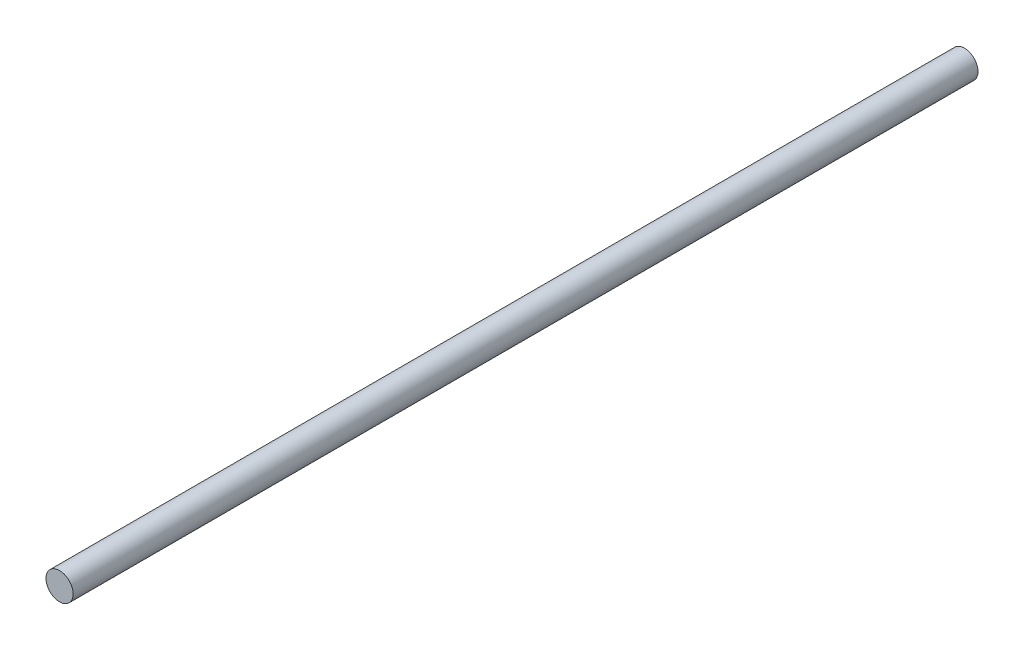
ISO-10303-21;
HEADER;
FILE_DESCRIPTION(('STEP AP214'),'2;1');
FILE_NAME('part.step','',(''),(''),'','','');
FILE_SCHEMA(('AUTOMOTIVE_DESIGN { 1 0 10303 214 1 1 1 1 }'));
ENDSEC;
DATA;
#1=APPLICATION_CONTEXT('core data for automotive mechanical design processes');
#2=APPLICATION_PROTOCOL_DEFINITION('international standard','automotive_design',2000,#1);
#3=PRODUCT_CONTEXT('',#1,'mechanical');
#4=PRODUCT('Part','Part','',(#3));
#5=PRODUCT_RELATED_PRODUCT_CATEGORY('part','',(#4));
#6=PRODUCT_DEFINITION_FORMATION('','',#4);
#7=PRODUCT_DEFINITION_CONTEXT('part definition',#1,'design');
#8=PRODUCT_DEFINITION('design','',#6,#7);
#9=PRODUCT_DEFINITION_SHAPE('','',#8);
#10=(LENGTH_UNIT() NAMED_UNIT(*) SI_UNIT(.MILLI.,.METRE.));
#11=(NAMED_UNIT(*) PLANE_ANGLE_UNIT() SI_UNIT($,.RADIAN.));
#12=(NAMED_UNIT(*) SI_UNIT($,.STERADIAN.) SOLID_ANGLE_UNIT());
#13=UNCERTAINTY_MEASURE_WITH_UNIT(LENGTH_MEASURE(1.E-05),#10,'distance_accuracy_value','');
#14=(GEOMETRIC_REPRESENTATION_CONTEXT(3) GLOBAL_UNCERTAINTY_ASSIGNED_CONTEXT((#13)) GLOBAL_UNIT_ASSIGNED_CONTEXT((#10,
#11,#12)) REPRESENTATION_CONTEXT('',''));
#15=CARTESIAN_POINT('',(0.,0.,0.));
#16=DIRECTION('',(0.,0.,1.));
#17=DIRECTION('',(1.,0.,0.));
#18=AXIS2_PLACEMENT_3D('',#15,#16,#17);
#19=CARTESIAN_POINT('',(0.,0.,400.));
#20=DIRECTION('',(0.,0.,-1.));
#21=DIRECTION('',(-1.,0.,0.));
#22=AXIS2_PLACEMENT_3D('',#19,#20,#21);
#23=CYLINDRICAL_SURFACE('',#22,6.);
#24=CARTESIAN_POINT('',(0.,0.,400.));
#25=DIRECTION('',(0.,0.,1.));
#26=DIRECTION('',(1.,0.,0.));
#27=AXIS2_PLACEMENT_3D('',#24,#25,#26);
#28=CIRCLE('',#27,6.);
#29=CARTESIAN_POINT('',(6.,0.,400.));
#30=VERTEX_POINT('',#29);
#31=EDGE_CURVE('E10',#30,#30,#28,.T.);
#32=ORIENTED_EDGE('',*,*,#31,.F.);
#33=EDGE_LOOP('',(#32));
#34=FACE_BOUND('',#33,.T.);
#35=CARTESIAN_POINT('',(0.,0.,0.));
#36=DIRECTION('',(0.,0.,1.));
#37=DIRECTION('',(1.,0.,0.));
#38=AXIS2_PLACEMENT_3D('',#35,#36,#37);
#39=CIRCLE('',#38,6.);
#40=CARTESIAN_POINT('',(6.,0.,0.));
#41=VERTEX_POINT('',#40);
#42=EDGE_CURVE('E40',#41,#41,#39,.T.);
#43=ORIENTED_EDGE('',*,*,#42,.T.);
#44=EDGE_LOOP('',(#43));
#45=FACE_BOUND('',#44,.T.);
#46=ADVANCED_FACE('F37',(#34,#45),#23,.T.);
#47=CARTESIAN_POINT('',(0.,0.,400.));
#48=DIRECTION('',(0.,0.,1.));
#49=DIRECTION('',(1.,0.,0.));
#50=AXIS2_PLACEMENT_3D('',#47,#48,#49);
#51=PLANE('',#50);
#52=ORIENTED_EDGE('',*,*,#31,.T.);
#53=EDGE_LOOP('',(#52));
#54=FACE_BOUND('',#53,.T.);
#55=ADVANCED_FACE('F54',(#54),#51,.T.);
#56=CARTESIAN_POINT('',(0.,0.,0.));
#57=DIRECTION('',(0.,0.,1.));
#58=DIRECTION('',(1.,0.,0.));
#59=AXIS2_PLACEMENT_3D('',#56,#57,#58);
#60=PLANE('',#59);
#61=ORIENTED_EDGE('',*,*,#42,.F.);
#62=EDGE_LOOP('',(#61));
#63=FACE_BOUND('',#62,.T.);
#64=ADVANCED_FACE('F52',(#63),#60,.F.);
#65=CLOSED_SHELL('',(#46,#55,#64));
#66=MANIFOLD_SOLID_BREP('B2',#65);
#67=ADVANCED_BREP_SHAPE_REPRESENTATION('',(#18,#66),#14);
#68=SHAPE_DEFINITION_REPRESENTATION(#9,#67);
ENDSEC;
END-ISO-10303-21;
